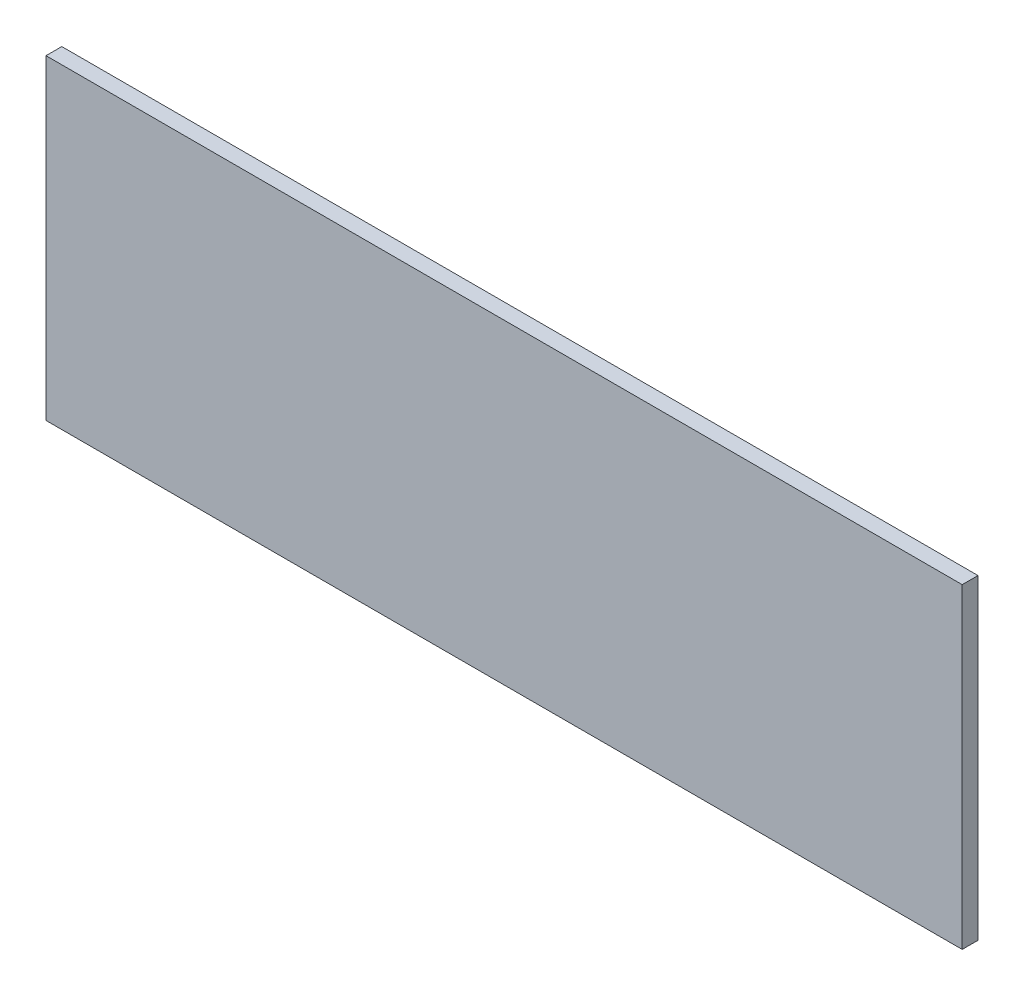
ISO-10303-21;
HEADER;
FILE_DESCRIPTION(('STEP AP214'),'2;1');
FILE_NAME('part.step','',(''),(''),'','','');
FILE_SCHEMA(('AUTOMOTIVE_DESIGN { 1 0 10303 214 1 1 1 1 }'));
ENDSEC;
DATA;
#1=APPLICATION_CONTEXT('core data for automotive mechanical design processes');
#2=APPLICATION_PROTOCOL_DEFINITION('international standard','automotive_design',2000,#1);
#3=PRODUCT_CONTEXT('',#1,'mechanical');
#4=PRODUCT('Part','Part','',(#3));
#5=PRODUCT_RELATED_PRODUCT_CATEGORY('part','',(#4));
#6=PRODUCT_DEFINITION_FORMATION('','',#4);
#7=PRODUCT_DEFINITION_CONTEXT('part definition',#1,'design');
#8=PRODUCT_DEFINITION('design','',#6,#7);
#9=PRODUCT_DEFINITION_SHAPE('','',#8);
#10=(LENGTH_UNIT() NAMED_UNIT(*) SI_UNIT(.MILLI.,.METRE.));
#11=(NAMED_UNIT(*) PLANE_ANGLE_UNIT() SI_UNIT($,.RADIAN.));
#12=(NAMED_UNIT(*) SI_UNIT($,.STERADIAN.) SOLID_ANGLE_UNIT());
#13=UNCERTAINTY_MEASURE_WITH_UNIT(LENGTH_MEASURE(1.E-05),#10,'distance_accuracy_value','');
#14=(GEOMETRIC_REPRESENTATION_CONTEXT(3) GLOBAL_UNCERTAINTY_ASSIGNED_CONTEXT((#13)) GLOBAL_UNIT_ASSIGNED_CONTEXT((#10,
#11,#12)) REPRESENTATION_CONTEXT('',''));
#15=CARTESIAN_POINT('',(0.,0.,0.));
#16=DIRECTION('',(0.,0.,1.));
#17=DIRECTION('',(1.,0.,0.));
#18=AXIS2_PLACEMENT_3D('',#15,#16,#17);
#19=CARTESIAN_POINT('',(145.,50.,5.));
#20=DIRECTION('',(-1.,0.,0.));
#21=DIRECTION('',(0.,0.,1.));
#22=AXIS2_PLACEMENT_3D('',#19,#20,#21);
#23=PLANE('',#22);
#24=DIRECTION('',(0.,1.,0.));
#25=VECTOR('',#24,1.);
#26=CARTESIAN_POINT('',(145.,50.,0.));
#27=LINE('',#26,#25);
#28=CARTESIAN_POINT('',(145.,-50.,0.));
#29=VERTEX_POINT('',#28);
#30=CARTESIAN_POINT('',(145.,50.,0.));
#31=VERTEX_POINT('',#30);
#32=EDGE_CURVE('E97',#29,#31,#27,.T.);
#33=ORIENTED_EDGE('',*,*,#32,.T.);
#34=DIRECTION('',(0.,0.,-1.));
#35=VECTOR('',#34,1.);
#36=CARTESIAN_POINT('',(145.,50.,5.));
#37=LINE('',#36,#35);
#38=CARTESIAN_POINT('',(145.,50.,5.));
#39=VERTEX_POINT('',#38);
#40=EDGE_CURVE('E11',#39,#31,#37,.T.);
#41=ORIENTED_EDGE('',*,*,#40,.F.);
#42=DIRECTION('',(0.,1.,0.));
#43=VECTOR('',#42,1.);
#44=CARTESIAN_POINT('',(145.,50.,5.));
#45=LINE('',#44,#43);
#46=CARTESIAN_POINT('',(145.,-50.,5.));
#47=VERTEX_POINT('',#46);
#48=EDGE_CURVE('E85',#47,#39,#45,.T.);
#49=ORIENTED_EDGE('',*,*,#48,.F.);
#50=DIRECTION('',(0.,0.,-1.));
#51=VECTOR('',#50,1.);
#52=CARTESIAN_POINT('',(145.,-50.,5.));
#53=LINE('',#52,#51);
#54=EDGE_CURVE('E93',#47,#29,#53,.T.);
#55=ORIENTED_EDGE('',*,*,#54,.T.);
#56=EDGE_LOOP('',(#33,#41,#49,#55));
#57=FACE_BOUND('',#56,.T.);
#58=ADVANCED_FACE('F34',(#57),#23,.F.);
#59=CARTESIAN_POINT('',(-145.,50.,5.));
#60=DIRECTION('',(0.,-1.,0.));
#61=DIRECTION('',(0.,0.,-1.));
#62=AXIS2_PLACEMENT_3D('',#59,#60,#61);
#63=PLANE('',#62);
#64=DIRECTION('',(-1.,0.,0.));
#65=VECTOR('',#64,1.);
#66=CARTESIAN_POINT('',(-145.,50.,0.));
#67=LINE('',#66,#65);
#68=CARTESIAN_POINT('',(-145.,50.,0.));
#69=VERTEX_POINT('',#68);
#70=EDGE_CURVE('E89',#31,#69,#67,.T.);
#71=ORIENTED_EDGE('',*,*,#70,.T.);
#72=DIRECTION('',(0.,0.,-1.));
#73=VECTOR('',#72,1.);
#74=CARTESIAN_POINT('',(-145.,50.,5.));
#75=LINE('',#74,#73);
#76=CARTESIAN_POINT('',(-145.,50.,5.));
#77=VERTEX_POINT('',#76);
#78=EDGE_CURVE('E42',#77,#69,#75,.T.);
#79=ORIENTED_EDGE('',*,*,#78,.F.);
#80=DIRECTION('',(-1.,0.,0.));
#81=VECTOR('',#80,1.);
#82=CARTESIAN_POINT('',(-145.,50.,5.));
#83=LINE('',#82,#81);
#84=EDGE_CURVE('E80',#39,#77,#83,.T.);
#85=ORIENTED_EDGE('',*,*,#84,.F.);
#86=ORIENTED_EDGE('',*,*,#40,.T.);
#87=EDGE_LOOP('',(#71,#79,#85,#86));
#88=FACE_BOUND('',#87,.T.);
#89=ADVANCED_FACE('F88',(#88),#63,.F.);
#90=CARTESIAN_POINT('',(-145.,50.,5.));
#91=DIRECTION('',(1.,0.,0.));
#92=DIRECTION('',(0.,1.,0.));
#93=AXIS2_PLACEMENT_3D('',#90,#91,#92);
#94=PLANE('',#93);
#95=DIRECTION('',(0.,-1.,0.));
#96=VECTOR('',#95,1.);
#97=CARTESIAN_POINT('',(-145.,50.,0.));
#98=LINE('',#97,#96);
#99=CARTESIAN_POINT('',(-145.,-50.,0.));
#100=VERTEX_POINT('',#99);
#101=EDGE_CURVE('E67',#69,#100,#98,.T.);
#102=ORIENTED_EDGE('',*,*,#101,.T.);
#103=DIRECTION('',(0.,0.,-1.));
#104=VECTOR('',#103,1.);
#105=CARTESIAN_POINT('',(-145.,-50.,5.));
#106=LINE('',#105,#104);
#107=CARTESIAN_POINT('',(-145.,-50.,5.));
#108=VERTEX_POINT('',#107);
#109=EDGE_CURVE('E90',#108,#100,#106,.T.);
#110=ORIENTED_EDGE('',*,*,#109,.F.);
#111=DIRECTION('',(0.,-1.,0.));
#112=VECTOR('',#111,1.);
#113=CARTESIAN_POINT('',(-145.,50.,5.));
#114=LINE('',#113,#112);
#115=EDGE_CURVE('E83',#77,#108,#114,.T.);
#116=ORIENTED_EDGE('',*,*,#115,.F.);
#117=ORIENTED_EDGE('',*,*,#78,.T.);
#118=EDGE_LOOP('',(#102,#110,#116,#117));
#119=FACE_BOUND('',#118,.T.);
#120=ADVANCED_FACE('F91',(#119),#94,.F.);
#121=CARTESIAN_POINT('',(-145.,-50.,5.));
#122=DIRECTION('',(0.,1.,0.));
#123=DIRECTION('',(0.,0.,1.));
#124=AXIS2_PLACEMENT_3D('',#121,#122,#123);
#125=PLANE('',#124);
#126=DIRECTION('',(1.,0.,0.));
#127=VECTOR('',#126,1.);
#128=CARTESIAN_POINT('',(-145.,-50.,0.));
#129=LINE('',#128,#127);
#130=EDGE_CURVE('E73',#100,#29,#129,.T.);
#131=ORIENTED_EDGE('',*,*,#130,.T.);
#132=ORIENTED_EDGE('',*,*,#54,.F.);
#133=DIRECTION('',(1.,0.,0.));
#134=VECTOR('',#133,1.);
#135=CARTESIAN_POINT('',(-145.,-50.,5.));
#136=LINE('',#135,#134);
#137=EDGE_CURVE('E50',#108,#47,#136,.T.);
#138=ORIENTED_EDGE('',*,*,#137,.F.);
#139=ORIENTED_EDGE('',*,*,#109,.T.);
#140=EDGE_LOOP('',(#131,#132,#138,#139));
#141=FACE_BOUND('',#140,.T.);
#142=ADVANCED_FACE('F104',(#141),#125,.F.);
#143=CARTESIAN_POINT('',(0.,0.,5.));
#144=DIRECTION('',(0.,0.,1.));
#145=DIRECTION('',(1.,0.,0.));
#146=AXIS2_PLACEMENT_3D('',#143,#144,#145);
#147=PLANE('',#146);
#148=ORIENTED_EDGE('',*,*,#48,.T.);
#149=ORIENTED_EDGE('',*,*,#84,.T.);
#150=ORIENTED_EDGE('',*,*,#115,.T.);
#151=ORIENTED_EDGE('',*,*,#137,.T.);
#152=EDGE_LOOP('',(#148,#149,#150,#151));
#153=FACE_BOUND('',#152,.T.);
#154=ADVANCED_FACE('F81',(#153),#147,.T.);
#155=CARTESIAN_POINT('',(0.,0.,0.));
#156=DIRECTION('',(0.,0.,1.));
#157=DIRECTION('',(1.,0.,0.));
#158=AXIS2_PLACEMENT_3D('',#155,#156,#157);
#159=PLANE('',#158);
#160=ORIENTED_EDGE('',*,*,#32,.F.);
#161=ORIENTED_EDGE('',*,*,#130,.F.);
#162=ORIENTED_EDGE('',*,*,#101,.F.);
#163=ORIENTED_EDGE('',*,*,#70,.F.);
#164=EDGE_LOOP('',(#160,#161,#162,#163));
#165=FACE_BOUND('',#164,.T.);
#166=ADVANCED_FACE('F107',(#165),#159,.F.);
#167=CLOSED_SHELL('',(#58,#89,#120,#142,#154,#166));
#168=MANIFOLD_SOLID_BREP('B2',#167);
#169=ADVANCED_BREP_SHAPE_REPRESENTATION('',(#18,#168),#14);
#170=SHAPE_DEFINITION_REPRESENTATION(#9,#169);
ENDSEC;
END-ISO-10303-21;
